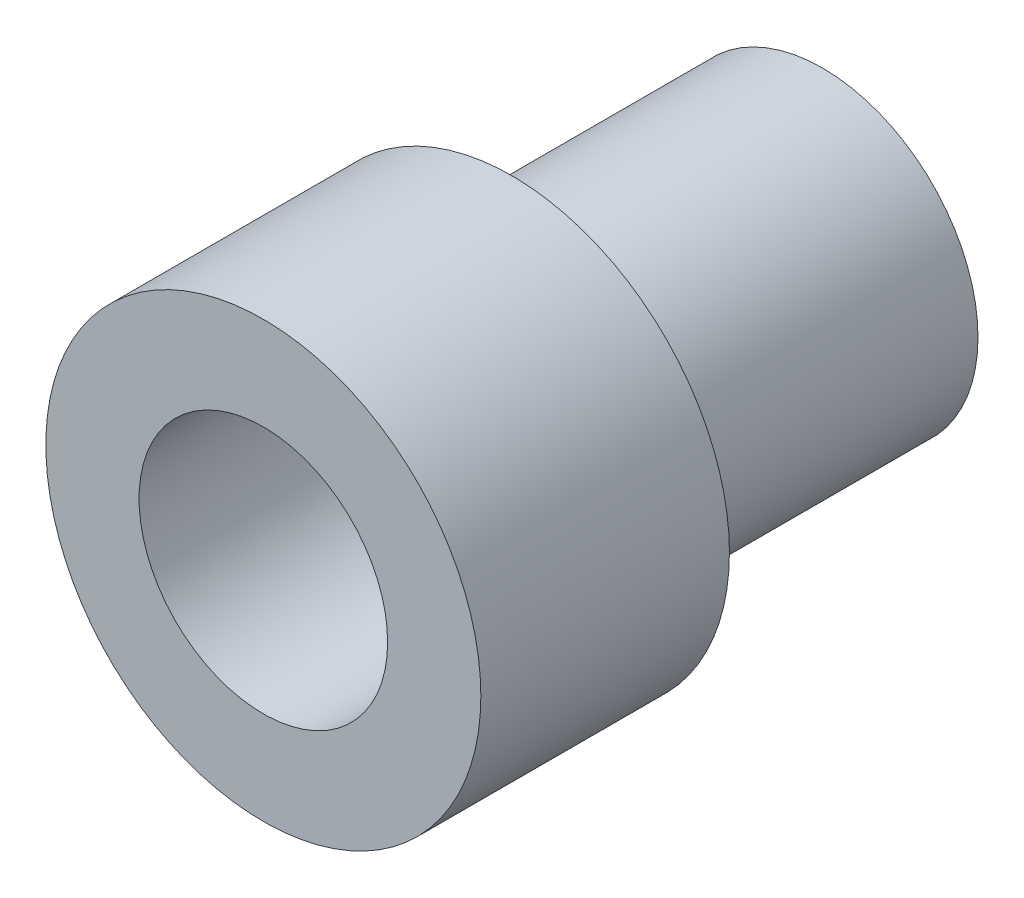
ISO-10303-21;
HEADER;
FILE_DESCRIPTION(('STEP AP214'),'2;1');
FILE_NAME('part.step','',(''),(''),'','','');
FILE_SCHEMA(('AUTOMOTIVE_DESIGN { 1 0 10303 214 1 1 1 1 }'));
ENDSEC;
DATA;
#1=APPLICATION_CONTEXT('core data for automotive mechanical design processes');
#2=APPLICATION_PROTOCOL_DEFINITION('international standard','automotive_design',2000,#1);
#3=PRODUCT_CONTEXT('',#1,'mechanical');
#4=PRODUCT('Part','Part','',(#3));
#5=PRODUCT_RELATED_PRODUCT_CATEGORY('part','',(#4));
#6=PRODUCT_DEFINITION_FORMATION('','',#4);
#7=PRODUCT_DEFINITION_CONTEXT('part definition',#1,'design');
#8=PRODUCT_DEFINITION('design','',#6,#7);
#9=PRODUCT_DEFINITION_SHAPE('','',#8);
#10=(LENGTH_UNIT() NAMED_UNIT(*) SI_UNIT(.MILLI.,.METRE.));
#11=(NAMED_UNIT(*) PLANE_ANGLE_UNIT() SI_UNIT($,.RADIAN.));
#12=(NAMED_UNIT(*) SI_UNIT($,.STERADIAN.) SOLID_ANGLE_UNIT());
#13=UNCERTAINTY_MEASURE_WITH_UNIT(LENGTH_MEASURE(1.E-05),#10,'distance_accuracy_value','');
#14=(GEOMETRIC_REPRESENTATION_CONTEXT(3) GLOBAL_UNCERTAINTY_ASSIGNED_CONTEXT((#13)) GLOBAL_UNIT_ASSIGNED_CONTEXT((#10,
#11,#12)) REPRESENTATION_CONTEXT('',''));
#15=CARTESIAN_POINT('',(0.,0.,0.));
#16=DIRECTION('',(0.,0.,1.));
#17=DIRECTION('',(1.,0.,0.));
#18=AXIS2_PLACEMENT_3D('',#15,#16,#17);
#19=CARTESIAN_POINT('',(0.,0.,5.));
#20=DIRECTION('',(0.,0.,1.));
#21=DIRECTION('',(1.,0.,0.));
#22=AXIS2_PLACEMENT_3D('',#19,#20,#21);
#23=PLANE('',#22);
#24=CARTESIAN_POINT('',(0.,0.,5.));
#25=DIRECTION('',(0.,0.,1.));
#26=DIRECTION('',(1.,0.,0.));
#27=AXIS2_PLACEMENT_3D('',#24,#25,#26);
#28=CIRCLE('',#27,2.);
#29=CARTESIAN_POINT('',(2.,0.,5.));
#30=VERTEX_POINT('',#29);
#31=EDGE_CURVE('E10',#30,#30,#28,.F.);
#32=ORIENTED_EDGE('',*,*,#31,.F.);
#33=EDGE_LOOP('',(#32));
#34=FACE_BOUND('',#33,.T.);
#35=CARTESIAN_POINT('',(0.,0.,5.));
#36=DIRECTION('',(0.,0.,1.));
#37=DIRECTION('',(1.,0.,0.));
#38=AXIS2_PLACEMENT_3D('',#35,#36,#37);
#39=CIRCLE('',#38,1.5);
#40=CARTESIAN_POINT('',(1.5,0.,5.));
#41=VERTEX_POINT('',#40);
#42=EDGE_CURVE('E46',#41,#41,#39,.T.);
#43=ORIENTED_EDGE('',*,*,#42,.F.);
#44=EDGE_LOOP('',(#43));
#45=FACE_BOUND('',#44,.T.);
#46=ADVANCED_FACE('F30',(#34,#45),#23,.T.);
#47=CARTESIAN_POINT('',(0.,0.,0.));
#48=DIRECTION('',(0.,0.,1.));
#49=DIRECTION('',(1.,0.,0.));
#50=AXIS2_PLACEMENT_3D('',#47,#48,#49);
#51=PLANE('',#50);
#52=CARTESIAN_POINT('',(0.,0.,0.));
#53=DIRECTION('',(0.,0.,1.));
#54=DIRECTION('',(1.,0.,0.));
#55=AXIS2_PLACEMENT_3D('',#52,#53,#54);
#56=CIRCLE('',#55,2.5);
#57=CARTESIAN_POINT('',(2.5,0.,0.));
#58=VERTEX_POINT('',#57);
#59=EDGE_CURVE('E41',#58,#58,#56,.T.);
#60=ORIENTED_EDGE('',*,*,#59,.F.);
#61=EDGE_LOOP('',(#60));
#62=FACE_BOUND('',#61,.T.);
#63=CARTESIAN_POINT('',(0.,0.,0.));
#64=DIRECTION('',(0.,0.,1.));
#65=DIRECTION('',(1.,0.,0.));
#66=AXIS2_PLACEMENT_3D('',#63,#64,#65);
#67=CIRCLE('',#66,1.5);
#68=CARTESIAN_POINT('',(1.5,0.,0.));
#69=VERTEX_POINT('',#68);
#70=EDGE_CURVE('E48',#69,#69,#67,.T.);
#71=ORIENTED_EDGE('',*,*,#70,.T.);
#72=EDGE_LOOP('',(#71));
#73=FACE_BOUND('',#72,.T.);
#74=ADVANCED_FACE('F82',(#62,#73),#51,.F.);
#75=CARTESIAN_POINT('',(0.,0.,5.));
#76=DIRECTION('',(0.,0.,-1.));
#77=DIRECTION('',(-1.,0.,0.));
#78=AXIS2_PLACEMENT_3D('',#75,#76,#77);
#79=CYLINDRICAL_SURFACE('',#78,2.5);
#80=CARTESIAN_POINT('',(0.,0.,5.));
#81=DIRECTION('',(0.,0.,1.));
#82=DIRECTION('',(1.,0.,0.));
#83=AXIS2_PLACEMENT_3D('',#80,#81,#82);
#84=CIRCLE('',#83,2.5);
#85=CARTESIAN_POINT('',(2.5,0.,5.));
#86=VERTEX_POINT('',#85);
#87=EDGE_CURVE('E37',#86,#86,#84,.T.);
#88=ORIENTED_EDGE('',*,*,#87,.F.);
#89=EDGE_LOOP('',(#88));
#90=FACE_BOUND('',#89,.T.);
#91=ORIENTED_EDGE('',*,*,#59,.T.);
#92=EDGE_LOOP('',(#91));
#93=FACE_BOUND('',#92,.T.);
#94=ADVANCED_FACE('F32',(#90,#93),#79,.T.);
#95=CARTESIAN_POINT('',(0.,0.,5.));
#96=DIRECTION('',(0.,0.,-1.));
#97=DIRECTION('',(-1.,0.,0.));
#98=AXIS2_PLACEMENT_3D('',#95,#96,#97);
#99=CYLINDRICAL_SURFACE('',#98,1.5);
#100=ORIENTED_EDGE('',*,*,#42,.T.);
#101=EDGE_LOOP('',(#100));
#102=FACE_BOUND('',#101,.T.);
#103=ORIENTED_EDGE('',*,*,#70,.F.);
#104=EDGE_LOOP('',(#103));
#105=FACE_BOUND('',#104,.T.);
#106=ADVANCED_FACE('F77',(#102,#105),#99,.F.);
#107=CARTESIAN_POINT('',(0.,0.,5.));
#108=DIRECTION('',(0.,0.,1.));
#109=DIRECTION('',(1.,0.,0.));
#110=AXIS2_PLACEMENT_3D('',#107,#108,#109);
#111=PLANE('',#110);
#112=CARTESIAN_POINT('',(0.,0.,5.));
#113=DIRECTION('',(0.,0.,1.));
#114=DIRECTION('',(1.,0.,0.));
#115=AXIS2_PLACEMENT_3D('',#112,#113,#114);
#116=CIRCLE('',#115,3.5);
#117=CARTESIAN_POINT('',(3.5,0.,5.));
#118=VERTEX_POINT('',#117);
#119=EDGE_CURVE('E54',#118,#118,#116,.T.);
#120=ORIENTED_EDGE('',*,*,#119,.F.);
#121=EDGE_LOOP('',(#120));
#122=FACE_BOUND('',#121,.T.);
#123=ORIENTED_EDGE('',*,*,#87,.T.);
#124=EDGE_LOOP('',(#123));
#125=FACE_BOUND('',#124,.T.);
#126=ADVANCED_FACE('F68',(#122,#125),#111,.F.);
#127=CARTESIAN_POINT('',(0.,0.,9.));
#128=DIRECTION('',(0.,0.,1.));
#129=DIRECTION('',(1.,0.,0.));
#130=AXIS2_PLACEMENT_3D('',#127,#128,#129);
#131=PLANE('',#130);
#132=CARTESIAN_POINT('',(0.,0.,9.));
#133=DIRECTION('',(0.,0.,1.));
#134=DIRECTION('',(1.,0.,0.));
#135=AXIS2_PLACEMENT_3D('',#132,#133,#134);
#136=CIRCLE('',#135,3.5);
#137=CARTESIAN_POINT('',(3.5,0.,9.));
#138=VERTEX_POINT('',#137);
#139=EDGE_CURVE('E51',#138,#138,#136,.T.);
#140=ORIENTED_EDGE('',*,*,#139,.T.);
#141=EDGE_LOOP('',(#140));
#142=FACE_BOUND('',#141,.T.);
#143=CARTESIAN_POINT('',(0.,0.,9.));
#144=DIRECTION('',(0.,0.,1.));
#145=DIRECTION('',(1.,0.,0.));
#146=AXIS2_PLACEMENT_3D('',#143,#144,#145);
#147=CIRCLE('',#146,2.);
#148=CARTESIAN_POINT('',(2.,0.,9.));
#149=VERTEX_POINT('',#148);
#150=EDGE_CURVE('E57',#149,#149,#147,.T.);
#151=ORIENTED_EDGE('',*,*,#150,.F.);
#152=EDGE_LOOP('',(#151));
#153=FACE_BOUND('',#152,.T.);
#154=ADVANCED_FACE('F65',(#142,#153),#131,.T.);
#155=CARTESIAN_POINT('',(0.,0.,9.));
#156=DIRECTION('',(0.,0.,-1.));
#157=DIRECTION('',(-1.,0.,0.));
#158=AXIS2_PLACEMENT_3D('',#155,#156,#157);
#159=CYLINDRICAL_SURFACE('',#158,3.5);
#160=ORIENTED_EDGE('',*,*,#139,.F.);
#161=EDGE_LOOP('',(#160));
#162=FACE_BOUND('',#161,.T.);
#163=ORIENTED_EDGE('',*,*,#119,.T.);
#164=EDGE_LOOP('',(#163));
#165=FACE_BOUND('',#164,.T.);
#166=ADVANCED_FACE('F67',(#162,#165),#159,.T.);
#167=CARTESIAN_POINT('',(0.,0.,9.));
#168=DIRECTION('',(0.,0.,-1.));
#169=DIRECTION('',(-1.,0.,0.));
#170=AXIS2_PLACEMENT_3D('',#167,#168,#169);
#171=CYLINDRICAL_SURFACE('',#170,2.);
#172=ORIENTED_EDGE('',*,*,#150,.T.);
#173=EDGE_LOOP('',(#172));
#174=FACE_BOUND('',#173,.T.);
#175=ORIENTED_EDGE('',*,*,#31,.T.);
#176=EDGE_LOOP('',(#175));
#177=FACE_BOUND('',#176,.T.);
#178=ADVANCED_FACE('F63',(#174,#177),#171,.F.);
#179=CLOSED_SHELL('',(#46,#74,#94,#106,#126,#154,#166,#178));
#180=MANIFOLD_SOLID_BREP('B2',#179);
#181=ADVANCED_BREP_SHAPE_REPRESENTATION('',(#18,#180),#14);
#182=SHAPE_DEFINITION_REPRESENTATION(#9,#181);
ENDSEC;
END-ISO-10303-21;
